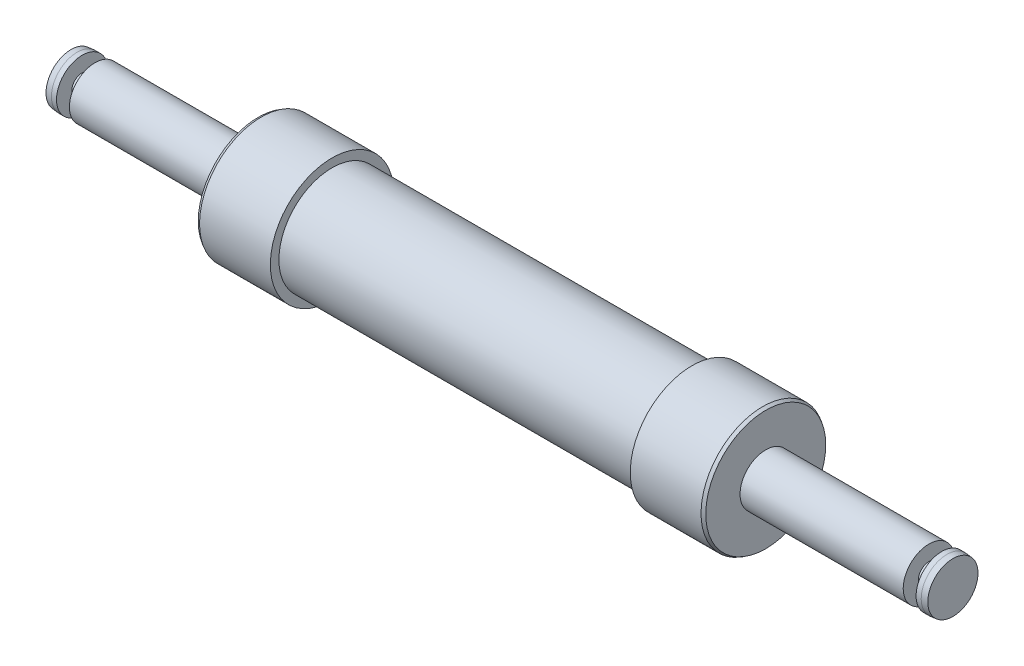
ISO-10303-21;
HEADER;
FILE_DESCRIPTION(('STEP AP214'),'2;1');
FILE_NAME('part.step','',(''),(''),'','','');
FILE_SCHEMA(('AUTOMOTIVE_DESIGN { 1 0 10303 214 1 1 1 1 }'));
ENDSEC;
DATA;
#1=APPLICATION_CONTEXT('core data for automotive mechanical design processes');
#2=APPLICATION_PROTOCOL_DEFINITION('international standard','automotive_design',2000,#1);
#3=PRODUCT_CONTEXT('',#1,'mechanical');
#4=PRODUCT('Part','Part','',(#3));
#5=PRODUCT_RELATED_PRODUCT_CATEGORY('part','',(#4));
#6=PRODUCT_DEFINITION_FORMATION('','',#4);
#7=PRODUCT_DEFINITION_CONTEXT('part definition',#1,'design');
#8=PRODUCT_DEFINITION('design','',#6,#7);
#9=PRODUCT_DEFINITION_SHAPE('','',#8);
#10=(LENGTH_UNIT() NAMED_UNIT(*) SI_UNIT(.MILLI.,.METRE.));
#11=(NAMED_UNIT(*) PLANE_ANGLE_UNIT() SI_UNIT($,.RADIAN.));
#12=(NAMED_UNIT(*) SI_UNIT($,.STERADIAN.) SOLID_ANGLE_UNIT());
#13=UNCERTAINTY_MEASURE_WITH_UNIT(LENGTH_MEASURE(1.E-05),#10,'distance_accuracy_value','');
#14=(GEOMETRIC_REPRESENTATION_CONTEXT(3) GLOBAL_UNCERTAINTY_ASSIGNED_CONTEXT((#13)) GLOBAL_UNIT_ASSIGNED_CONTEXT((#10,
#11,#12)) REPRESENTATION_CONTEXT('',''));
#15=CARTESIAN_POINT('',(0.,0.,0.));
#16=DIRECTION('',(0.,0.,1.));
#17=DIRECTION('',(1.,0.,0.));
#18=AXIS2_PLACEMENT_3D('',#15,#16,#17);
#19=CARTESIAN_POINT('',(0.,0.,0.));
#20=DIRECTION('',(-1.,0.,0.));
#21=DIRECTION('',(0.,-1.,0.));
#22=AXIS2_PLACEMENT_3D('',#19,#20,#21);
#23=CYLINDRICAL_SURFACE('',#22,7.2);
#24=CARTESIAN_POINT('',(-29.26,0.,0.));
#25=DIRECTION('',(1.,0.,0.));
#26=DIRECTION('',(0.,0.,-1.));
#27=AXIS2_PLACEMENT_3D('',#24,#25,#26);
#28=CIRCLE('',#27,7.2);
#29=CARTESIAN_POINT('',(-29.26,-7.2,0.));
#30=VERTEX_POINT('',#29);
#31=EDGE_CURVE('E56',#30,#30,#28,.T.);
#32=CARTESIAN_POINT('',(-21.,0.,0.));
#33=DIRECTION('',(1.,0.,0.));
#34=DIRECTION('',(0.,0.,-1.));
#35=AXIS2_PLACEMENT_3D('',#32,#33,#34);
#36=CIRCLE('',#35,7.2);
#37=CARTESIAN_POINT('',(-21.,-7.2,0.));
#38=VERTEX_POINT('',#37);
#39=EDGE_CURVE('E45',#38,#38,#36,.T.);
#40=CARTESIAN_POINT('',(-29.26,-7.2,0.));
#41=CARTESIAN_POINT('',(-29.1739583333333,-7.2,0.));
#42=CARTESIAN_POINT('',(-29.0879166666667,-7.2,0.));
#43=CARTESIAN_POINT('',(-28.9158333333333,-7.2,0.));
#44=CARTESIAN_POINT('',(-28.8297916666667,-7.2,0.));
#45=CARTESIAN_POINT('',(-28.6577083333333,-7.2,0.));
#46=CARTESIAN_POINT('',(-28.5716666666667,-7.2,0.));
#47=CARTESIAN_POINT('',(-28.3995833333333,-7.2,0.));
#48=CARTESIAN_POINT('',(-28.3135416666667,-7.2,0.));
#49=CARTESIAN_POINT('',(-28.1414583333333,-7.2,0.));
#50=CARTESIAN_POINT('',(-28.0554166666667,-7.2,0.));
#51=CARTESIAN_POINT('',(-27.8833333333333,-7.2,0.));
#52=CARTESIAN_POINT('',(-27.7972916666667,-7.2,0.));
#53=CARTESIAN_POINT('',(-27.6252083333333,-7.2,0.));
#54=CARTESIAN_POINT('',(-27.5391666666667,-7.2,0.));
#55=CARTESIAN_POINT('',(-27.3670833333333,-7.2,0.));
#56=CARTESIAN_POINT('',(-27.2810416666667,-7.2,0.));
#57=CARTESIAN_POINT('',(-27.1089583333333,-7.2,0.));
#58=CARTESIAN_POINT('',(-27.0229166666667,-7.2,0.));
#59=CARTESIAN_POINT('',(-26.8508333333333,-7.2,0.));
#60=CARTESIAN_POINT('',(-26.7647916666667,-7.2,0.));
#61=CARTESIAN_POINT('',(-26.5927083333333,-7.2,0.));
#62=CARTESIAN_POINT('',(-26.5066666666667,-7.2,0.));
#63=CARTESIAN_POINT('',(-26.3345833333333,-7.2,0.));
#64=CARTESIAN_POINT('',(-26.2485416666667,-7.2,0.));
#65=CARTESIAN_POINT('',(-26.0764583333333,-7.2,0.));
#66=CARTESIAN_POINT('',(-25.9904166666667,-7.2,0.));
#67=CARTESIAN_POINT('',(-25.8183333333333,-7.2,0.));
#68=CARTESIAN_POINT('',(-25.7322916666667,-7.2,0.));
#69=CARTESIAN_POINT('',(-25.5602083333333,-7.2,0.));
#70=CARTESIAN_POINT('',(-25.4741666666667,-7.2,0.));
#71=CARTESIAN_POINT('',(-25.3020833333333,-7.2,0.));
#72=CARTESIAN_POINT('',(-25.2160416666667,-7.2,0.));
#73=CARTESIAN_POINT('',(-25.0439583333333,-7.2,0.));
#74=CARTESIAN_POINT('',(-24.9579166666667,-7.2,0.));
#75=CARTESIAN_POINT('',(-24.7858333333333,-7.2,0.));
#76=CARTESIAN_POINT('',(-24.6997916666667,-7.2,0.));
#77=CARTESIAN_POINT('',(-24.5277083333333,-7.2,0.));
#78=CARTESIAN_POINT('',(-24.4416666666667,-7.2,0.));
#79=CARTESIAN_POINT('',(-24.2695833333333,-7.2,0.));
#80=CARTESIAN_POINT('',(-24.1835416666667,-7.2,0.));
#81=CARTESIAN_POINT('',(-24.0114583333333,-7.2,0.));
#82=CARTESIAN_POINT('',(-23.9254166666667,-7.2,0.));
#83=CARTESIAN_POINT('',(-23.7533333333333,-7.2,0.));
#84=CARTESIAN_POINT('',(-23.6672916666667,-7.2,0.));
#85=CARTESIAN_POINT('',(-23.4952083333333,-7.2,0.));
#86=CARTESIAN_POINT('',(-23.4091666666667,-7.2,0.));
#87=CARTESIAN_POINT('',(-23.2370833333333,-7.2,0.));
#88=CARTESIAN_POINT('',(-23.1510416666667,-7.2,0.));
#89=CARTESIAN_POINT('',(-22.9789583333333,-7.2,0.));
#90=CARTESIAN_POINT('',(-22.8929166666667,-7.2,0.));
#91=CARTESIAN_POINT('',(-22.7208333333333,-7.2,0.));
#92=CARTESIAN_POINT('',(-22.6347916666667,-7.2,0.));
#93=CARTESIAN_POINT('',(-22.4627083333333,-7.2,0.));
#94=CARTESIAN_POINT('',(-22.3766666666667,-7.2,0.));
#95=CARTESIAN_POINT('',(-22.2045833333333,-7.2,0.));
#96=CARTESIAN_POINT('',(-22.1185416666667,-7.2,0.));
#97=CARTESIAN_POINT('',(-21.9464583333334,-7.2,0.));
#98=CARTESIAN_POINT('',(-21.8604166666667,-7.2,0.));
#99=CARTESIAN_POINT('',(-21.6883333333334,-7.2,0.));
#100=CARTESIAN_POINT('',(-21.6022916666667,-7.2,0.));
#101=CARTESIAN_POINT('',(-21.4302083333334,-7.2,0.));
#102=CARTESIAN_POINT('',(-21.3441666666667,-7.2,0.));
#103=CARTESIAN_POINT('',(-21.1720833333334,-7.2,0.));
#104=CARTESIAN_POINT('',(-21.0860416666667,-7.2,0.));
#105=CARTESIAN_POINT('',(-21.,-7.2,0.));
#106=B_SPLINE_CURVE_WITH_KNOTS('',3,(#40,#41,#42,#43,#44,#45,#46,#47,#48,#49,#50,#51,#52,#53,
#54,#55,#56,#57,#58,#59,#60,#61,#62,#63,#64,#65,#66,#67,#68,#69,#70,#71,#72,#73,#74,#75,#76,#77,
#78,#79,#80,#81,#82,#83,#84,#85,#86,#87,#88,#89,#90,#91,#92,#93,#94,#95,#96,#97,#98,#99,#100,
#101,#102,#103,#104,#105),.UNSPECIFIED.,.F.,.F.,(4,2,2,2,2,2,2,2,2,2,2,2,2,2,2,2,2,2,2,2,2,2,2,
2,2,2,2,2,2,2,2,2,4),(0.,0.258124999999998,0.516249999999996,0.774374999999997,1.0325,
1.29062499999999,1.54874999999999,1.80687499999999,2.06499999999999,2.32312499999999,
2.58124999999999,2.83937499999999,3.09749999999999,3.35562499999998,3.61374999999998,
3.87187499999998,4.12999999999998,4.38812499999998,4.64624999999998,4.90437499999998,
5.16249999999998,5.42062499999997,5.67874999999998,5.93687499999997,6.19499999999997,
6.45312499999997,6.71124999999997,6.96937499999997,7.22749999999997,7.48562499999996,
7.74374999999997,8.00187499999996,8.25999999999996),.UNSPECIFIED.);
#107=EDGE_CURVE('BSEAM41',#30,#38,#106,.T.);
#108=ORIENTED_EDGE('',*,*,#31,.T.);
#109=ORIENTED_EDGE('',*,*,#39,.F.);
#110=ORIENTED_EDGE('',*,*,#107,.T.);
#111=ORIENTED_EDGE('',*,*,#107,.F.);
#112=EDGE_LOOP('',(#108,#110,#109,#111));
#113=FACE_BOUND('',#112,.T.);
#114=ADVANCED_FACE('F41',(#113),#23,.T.);
#115=CARTESIAN_POINT('',(-29.61,0.,0.));
#116=DIRECTION('',(-1.,0.,0.));
#117=DIRECTION('',(0.,0.,1.));
#118=AXIS2_PLACEMENT_3D('',#115,#116,#117);
#119=PLANE('',#118);
#120=CARTESIAN_POINT('',(-29.61,0.,0.));
#121=DIRECTION('',(-1.,0.,0.));
#122=DIRECTION('',(0.,0.,1.));
#123=AXIS2_PLACEMENT_3D('',#120,#121,#122);
#124=CIRCLE('',#123,7.);
#125=CARTESIAN_POINT('',(-29.61,0.,7.));
#126=VERTEX_POINT('',#125);
#127=EDGE_CURVE('E10',#126,#126,#124,.T.);
#128=ORIENTED_EDGE('',*,*,#127,.T.);
#129=EDGE_LOOP('',(#128));
#130=FACE_BOUND('',#129,.T.);
#131=CARTESIAN_POINT('',(-29.61,0.,0.));
#132=DIRECTION('',(-1.,0.,0.));
#133=DIRECTION('',(0.,0.,1.));
#134=AXIS2_PLACEMENT_3D('',#131,#132,#133);
#135=CIRCLE('',#134,3.);
#136=CARTESIAN_POINT('',(-29.61,0.,3.));
#137=VERTEX_POINT('',#136);
#138=EDGE_CURVE('E62',#137,#137,#135,.T.);
#139=ORIENTED_EDGE('',*,*,#138,.F.);
#140=EDGE_LOOP('',(#139));
#141=FACE_BOUND('',#140,.T.);
#142=ADVANCED_FACE('F160',(#130,#141),#119,.T.);
#143=CARTESIAN_POINT('',(-51.45,3.,0.));
#144=DIRECTION('',(1.,0.,0.));
#145=DIRECTION('',(0.,-1.,0.));
#146=AXIS2_PLACEMENT_3D('',#143,#144,#145);
#147=PLANE('',#146);
#148=CARTESIAN_POINT('',(-51.45,0.,0.));
#149=DIRECTION('',(-1.,0.,0.));
#150=DIRECTION('',(0.,0.,1.));
#151=AXIS2_PLACEMENT_3D('',#148,#149,#150);
#152=CIRCLE('',#151,2.92946920771663);
#153=CARTESIAN_POINT('',(-51.45,0.,2.92946920771663));
#154=VERTEX_POINT('',#153);
#155=EDGE_CURVE('E91',#154,#154,#152,.T.);
#156=ORIENTED_EDGE('',*,*,#155,.T.);
#157=EDGE_LOOP('',(#156));
#158=FACE_BOUND('',#157,.T.);
#159=ADVANCED_FACE('F167',(#158),#147,.F.);
#160=CARTESIAN_POINT('',(-50.7500000000002,0.,0.));
#161=DIRECTION('',(1.,0.,0.));
#162=DIRECTION('',(0.,0.,-1.));
#163=AXIS2_PLACEMENT_3D('',#160,#161,#162);
#164=CONICAL_SURFACE('',#163,3.,0.100419363009603);
#165=CARTESIAN_POINT('',(-50.7500000000002,0.,0.));
#166=DIRECTION('',(1.,0.,0.));
#167=DIRECTION('',(0.,0.,-1.));
#168=AXIS2_PLACEMENT_3D('',#165,#166,#167);
#169=CIRCLE('',#168,3.);
#170=CARTESIAN_POINT('',(-50.7500000000002,0.,-3.));
#171=VERTEX_POINT('',#170);
#172=EDGE_CURVE('E86',#171,#171,#169,.T.);
#173=ORIENTED_EDGE('',*,*,#172,.F.);
#174=EDGE_LOOP('',(#173));
#175=FACE_BOUND('',#174,.T.);
#176=ORIENTED_EDGE('',*,*,#155,.F.);
#177=EDGE_LOOP('',(#176));
#178=FACE_BOUND('',#177,.T.);
#179=ADVANCED_FACE('F359',(#175,#178),#164,.T.);
#180=CARTESIAN_POINT('',(0.,0.,0.));
#181=DIRECTION('',(1.,0.,0.));
#182=DIRECTION('',(0.,1.,0.));
#183=AXIS2_PLACEMENT_3D('',#180,#181,#182);
#184=CYLINDRICAL_SURFACE('',#183,3.);
#185=CARTESIAN_POINT('',(-50.155,0.,0.));
#186=DIRECTION('',(-1.,0.,0.));
#187=DIRECTION('',(0.,-1.,0.));
#188=AXIS2_PLACEMENT_3D('',#185,#186,#187);
#189=CIRCLE('',#188,3.);
#190=CARTESIAN_POINT('',(-50.155,-3.,0.));
#191=VERTEX_POINT('',#190);
#192=EDGE_CURVE('E72',#191,#191,#189,.T.);
#193=ORIENTED_EDGE('',*,*,#192,.T.);
#194=EDGE_LOOP('',(#193));
#195=FACE_BOUND('',#194,.T.);
#196=ORIENTED_EDGE('',*,*,#172,.T.);
#197=EDGE_LOOP('',(#196));
#198=FACE_BOUND('',#197,.T.);
#199=ADVANCED_FACE('F351',(#195,#198),#184,.T.);
#200=CARTESIAN_POINT('',(-50.155,1.22,0.));
#201=DIRECTION('',(-1.,0.,0.));
#202=DIRECTION('',(0.,0.,1.));
#203=AXIS2_PLACEMENT_3D('',#200,#201,#202);
#204=PLANE('',#203);
#205=CARTESIAN_POINT('',(-50.155,0.,0.));
#206=DIRECTION('',(1.,0.,0.));
#207=DIRECTION('',(0.,1.,0.));
#208=AXIS2_PLACEMENT_3D('',#205,#206,#207);
#209=CIRCLE('',#208,1.22);
#210=CARTESIAN_POINT('',(-50.155,1.22,0.));
#211=VERTEX_POINT('',#210);
#212=EDGE_CURVE('E73',#211,#211,#209,.T.);
#213=ORIENTED_EDGE('',*,*,#212,.F.);
#214=EDGE_LOOP('',(#213));
#215=FACE_BOUND('',#214,.T.);
#216=ORIENTED_EDGE('',*,*,#192,.F.);
#217=EDGE_LOOP('',(#216));
#218=FACE_BOUND('',#217,.T.);
#219=ADVANCED_FACE('F334',(#215,#218),#204,.F.);
#220=CARTESIAN_POINT('',(0.,0.,0.));
#221=DIRECTION('',(1.,0.,0.));
#222=DIRECTION('',(0.,0.,-1.));
#223=AXIS2_PLACEMENT_3D('',#220,#221,#222);
#224=CYLINDRICAL_SURFACE('',#223,1.22);
#225=CARTESIAN_POINT('',(-48.65,0.,0.));
#226=DIRECTION('',(1.,0.,0.));
#227=DIRECTION('',(0.,0.,-1.));
#228=AXIS2_PLACEMENT_3D('',#225,#226,#227);
#229=CIRCLE('',#228,1.22);
#230=CARTESIAN_POINT('',(-48.65,0.,-1.22));
#231=VERTEX_POINT('',#230);
#232=EDGE_CURVE('E74',#231,#231,#229,.T.);
#233=ORIENTED_EDGE('',*,*,#232,.F.);
#234=EDGE_LOOP('',(#233));
#235=FACE_BOUND('',#234,.T.);
#236=ORIENTED_EDGE('',*,*,#212,.T.);
#237=EDGE_LOOP('',(#236));
#238=FACE_BOUND('',#237,.T.);
#239=ADVANCED_FACE('F325',(#235,#238),#224,.T.);
#240=CARTESIAN_POINT('',(-48.65,1.22,0.));
#241=DIRECTION('',(1.,0.,0.));
#242=DIRECTION('',(0.,0.,-1.));
#243=AXIS2_PLACEMENT_3D('',#240,#241,#242);
#244=PLANE('',#243);
#245=ORIENTED_EDGE('',*,*,#232,.T.);
#246=EDGE_LOOP('',(#245));
#247=FACE_BOUND('',#246,.T.);
#248=CARTESIAN_POINT('',(-48.65,0.,0.));
#249=DIRECTION('',(1.,0.,0.));
#250=DIRECTION('',(0.,0.,-1.));
#251=AXIS2_PLACEMENT_3D('',#248,#249,#250);
#252=CIRCLE('',#251,3.);
#253=CARTESIAN_POINT('',(-48.65,0.,-3.));
#254=VERTEX_POINT('',#253);
#255=EDGE_CURVE('E68',#254,#254,#252,.T.);
#256=ORIENTED_EDGE('',*,*,#255,.F.);
#257=EDGE_LOOP('',(#256));
#258=FACE_BOUND('',#257,.T.);
#259=ADVANCED_FACE('F333',(#247,#258),#244,.F.);
#260=ORIENTED_EDGE('',*,*,#138,.T.);
#261=EDGE_LOOP('',(#260));
#262=FACE_BOUND('',#261,.T.);
#263=ORIENTED_EDGE('',*,*,#255,.T.);
#264=EDGE_LOOP('',(#263));
#265=FACE_BOUND('',#264,.T.);
#266=ADVANCED_FACE('F248',(#262,#265),#184,.T.);
#267=CARTESIAN_POINT('',(-29.26,0.,0.));
#268=DIRECTION('',(1.,0.,0.));
#269=DIRECTION('',(0.,0.,-1.));
#270=AXIS2_PLACEMENT_3D('',#267,#268,#269);
#271=CONICAL_SURFACE('',#270,7.2,0.519146114246495);
#272=ORIENTED_EDGE('',*,*,#31,.F.);
#273=EDGE_LOOP('',(#272));
#274=FACE_BOUND('',#273,.T.);
#275=ORIENTED_EDGE('',*,*,#127,.F.);
#276=EDGE_LOOP('',(#275));
#277=FACE_BOUND('',#276,.T.);
#278=ADVANCED_FACE('F43',(#274,#277),#271,.T.);
#279=CARTESIAN_POINT('',(-21.,6.2,0.));
#280=DIRECTION('',(1.,0.,0.));
#281=DIRECTION('',(0.,0.,-1.));
#282=AXIS2_PLACEMENT_3D('',#279,#280,#281);
#283=PLANE('',#282);
#284=CARTESIAN_POINT('',(-21.,0.,0.));
#285=DIRECTION('',(-1.,0.,0.));
#286=DIRECTION('',(0.,0.,1.));
#287=AXIS2_PLACEMENT_3D('',#284,#285,#286);
#288=CIRCLE('',#287,6.2);
#289=CARTESIAN_POINT('',(-21.,0.,6.2));
#290=VERTEX_POINT('',#289);
#291=EDGE_CURVE('E97',#290,#290,#288,.T.);
#292=ORIENTED_EDGE('',*,*,#291,.T.);
#293=EDGE_LOOP('',(#292));
#294=FACE_BOUND('',#293,.T.);
#295=ORIENTED_EDGE('',*,*,#39,.T.);
#296=EDGE_LOOP('',(#295));
#297=FACE_BOUND('',#296,.T.);
#298=ADVANCED_FACE('F247',(#294,#297),#283,.T.);
#299=CARTESIAN_POINT('',(21.,6.20000000000001,0.));
#300=DIRECTION('',(-1.,0.,0.));
#301=DIRECTION('',(0.,0.,1.));
#302=AXIS2_PLACEMENT_3D('',#299,#300,#301);
#303=PLANE('',#302);
#304=CARTESIAN_POINT('',(21.,0.,0.));
#305=DIRECTION('',(-1.,0.,0.));
#306=DIRECTION('',(0.,0.,1.));
#307=AXIS2_PLACEMENT_3D('',#304,#305,#306);
#308=CIRCLE('',#307,6.20000000000001);
#309=CARTESIAN_POINT('',(21.,0.,6.20000000000001));
#310=VERTEX_POINT('',#309);
#311=EDGE_CURVE('E104',#310,#310,#308,.T.);
#312=ORIENTED_EDGE('',*,*,#311,.F.);
#313=EDGE_LOOP('',(#312));
#314=FACE_BOUND('',#313,.T.);
#315=CARTESIAN_POINT('',(21.,0.,0.));
#316=DIRECTION('',(-1.,0.,0.));
#317=DIRECTION('',(0.,0.,1.));
#318=AXIS2_PLACEMENT_3D('',#315,#316,#317);
#319=CIRCLE('',#318,7.2);
#320=CARTESIAN_POINT('',(21.,-7.2,0.));
#321=VERTEX_POINT('',#320);
#322=EDGE_CURVE('E94',#321,#321,#319,.T.);
#323=ORIENTED_EDGE('',*,*,#322,.T.);
#324=EDGE_LOOP('',(#323));
#325=FACE_BOUND('',#324,.T.);
#326=ADVANCED_FACE('F265',(#314,#325),#303,.T.);
#327=CARTESIAN_POINT('',(-28.6049424910267,0.,0.));
#328=DIRECTION('',(-1.,0.,0.));
#329=DIRECTION('',(0.,0.,1.));
#330=AXIS2_PLACEMENT_3D('',#327,#328,#329);
#331=CYLINDRICAL_SURFACE('',#330,6.20000000000001);
#332=ORIENTED_EDGE('',*,*,#311,.T.);
#333=EDGE_LOOP('',(#332));
#334=FACE_BOUND('',#333,.T.);
#335=ORIENTED_EDGE('',*,*,#291,.F.);
#336=EDGE_LOOP('',(#335));
#337=FACE_BOUND('',#336,.T.);
#338=ADVANCED_FACE('F157',(#334,#337),#331,.T.);
#339=CARTESIAN_POINT('',(51.45,3.,0.));
#340=DIRECTION('',(-1.,0.,0.));
#341=DIRECTION('',(0.,-1.,0.));
#342=AXIS2_PLACEMENT_3D('',#339,#340,#341);
#343=PLANE('',#342);
#344=CARTESIAN_POINT('',(51.45,0.,0.));
#345=DIRECTION('',(1.,0.,0.));
#346=DIRECTION('',(0.,0.,-1.));
#347=AXIS2_PLACEMENT_3D('',#344,#345,#346);
#348=CIRCLE('',#347,2.92946920771663);
#349=CARTESIAN_POINT('',(51.45,0.,-2.92946920771663));
#350=VERTEX_POINT('',#349);
#351=EDGE_CURVE('E60',#350,#350,#348,.T.);
#352=ORIENTED_EDGE('',*,*,#351,.T.);
#353=EDGE_LOOP('',(#352));
#354=FACE_BOUND('',#353,.T.);
#355=ADVANCED_FACE('F142',(#354),#343,.F.);
#356=CARTESIAN_POINT('',(50.7500000000002,0.,0.));
#357=DIRECTION('',(-1.,0.,0.));
#358=DIRECTION('',(0.,0.,1.));
#359=AXIS2_PLACEMENT_3D('',#356,#357,#358);
#360=CONICAL_SURFACE('',#359,3.,0.100419363009603);
#361=ORIENTED_EDGE('',*,*,#351,.F.);
#362=EDGE_LOOP('',(#361));
#363=FACE_BOUND('',#362,.T.);
#364=CARTESIAN_POINT('',(50.7500000000002,0.,0.));
#365=DIRECTION('',(-1.,0.,0.));
#366=DIRECTION('',(0.,0.,1.));
#367=AXIS2_PLACEMENT_3D('',#364,#365,#366);
#368=CIRCLE('',#367,3.);
#369=CARTESIAN_POINT('',(50.7500000000002,0.,3.));
#370=VERTEX_POINT('',#369);
#371=EDGE_CURVE('E85',#370,#370,#368,.T.);
#372=ORIENTED_EDGE('',*,*,#371,.F.);
#373=EDGE_LOOP('',(#372));
#374=FACE_BOUND('',#373,.T.);
#375=ADVANCED_FACE('F144',(#363,#374),#360,.T.);
#376=CARTESIAN_POINT('',(0.,0.,0.));
#377=DIRECTION('',(-1.,0.,0.));
#378=DIRECTION('',(0.,-1.,0.));
#379=AXIS2_PLACEMENT_3D('',#376,#377,#378);
#380=CYLINDRICAL_SURFACE('',#379,3.);
#381=CARTESIAN_POINT('',(50.155,0.,0.));
#382=DIRECTION('',(1.,0.,0.));
#383=DIRECTION('',(0.,1.,0.));
#384=AXIS2_PLACEMENT_3D('',#381,#382,#383);
#385=CIRCLE('',#384,3.);
#386=CARTESIAN_POINT('',(50.155,3.,0.));
#387=VERTEX_POINT('',#386);
#388=EDGE_CURVE('E78',#387,#387,#385,.T.);
#389=ORIENTED_EDGE('',*,*,#388,.T.);
#390=EDGE_LOOP('',(#389));
#391=FACE_BOUND('',#390,.T.);
#392=ORIENTED_EDGE('',*,*,#371,.T.);
#393=EDGE_LOOP('',(#392));
#394=FACE_BOUND('',#393,.T.);
#395=ADVANCED_FACE('F147',(#391,#394),#380,.T.);
#396=CARTESIAN_POINT('',(50.155,1.22,0.));
#397=DIRECTION('',(1.,0.,0.));
#398=DIRECTION('',(0.,0.,1.));
#399=AXIS2_PLACEMENT_3D('',#396,#397,#398);
#400=PLANE('',#399);
#401=CARTESIAN_POINT('',(50.155,0.,0.));
#402=DIRECTION('',(1.,0.,0.));
#403=DIRECTION('',(0.,1.,0.));
#404=AXIS2_PLACEMENT_3D('',#401,#402,#403);
#405=CIRCLE('',#404,1.22);
#406=CARTESIAN_POINT('',(50.155,1.22,0.));
#407=VERTEX_POINT('',#406);
#408=EDGE_CURVE('E125',#407,#407,#405,.T.);
#409=ORIENTED_EDGE('',*,*,#408,.T.);
#410=EDGE_LOOP('',(#409));
#411=FACE_BOUND('',#410,.T.);
#412=ORIENTED_EDGE('',*,*,#388,.F.);
#413=EDGE_LOOP('',(#412));
#414=FACE_BOUND('',#413,.T.);
#415=ADVANCED_FACE('F153',(#411,#414),#400,.F.);
#416=CARTESIAN_POINT('',(0.,0.,0.));
#417=DIRECTION('',(-1.,0.,0.));
#418=DIRECTION('',(0.,0.,1.));
#419=AXIS2_PLACEMENT_3D('',#416,#417,#418);
#420=CYLINDRICAL_SURFACE('',#419,1.22);
#421=CARTESIAN_POINT('',(48.65,0.,0.));
#422=DIRECTION('',(1.,0.,0.));
#423=DIRECTION('',(0.,0.,-1.));
#424=AXIS2_PLACEMENT_3D('',#421,#422,#423);
#425=CIRCLE('',#424,1.22);
#426=CARTESIAN_POINT('',(48.65,0.,-1.22));
#427=VERTEX_POINT('',#426);
#428=EDGE_CURVE('E66',#427,#427,#425,.T.);
#429=ORIENTED_EDGE('',*,*,#428,.T.);
#430=EDGE_LOOP('',(#429));
#431=FACE_BOUND('',#430,.T.);
#432=ORIENTED_EDGE('',*,*,#408,.F.);
#433=EDGE_LOOP('',(#432));
#434=FACE_BOUND('',#433,.T.);
#435=ADVANCED_FACE('F195',(#431,#434),#420,.T.);
#436=CARTESIAN_POINT('',(48.65,1.22,0.));
#437=DIRECTION('',(-1.,0.,0.));
#438=DIRECTION('',(0.,0.,-1.));
#439=AXIS2_PLACEMENT_3D('',#436,#437,#438);
#440=PLANE('',#439);
#441=ORIENTED_EDGE('',*,*,#428,.F.);
#442=EDGE_LOOP('',(#441));
#443=FACE_BOUND('',#442,.T.);
#444=CARTESIAN_POINT('',(48.65,0.,0.));
#445=DIRECTION('',(-1.,0.,0.));
#446=DIRECTION('',(0.,0.,1.));
#447=AXIS2_PLACEMENT_3D('',#444,#445,#446);
#448=CIRCLE('',#447,3.);
#449=CARTESIAN_POINT('',(48.65,0.,3.));
#450=VERTEX_POINT('',#449);
#451=EDGE_CURVE('E121',#450,#450,#448,.T.);
#452=ORIENTED_EDGE('',*,*,#451,.F.);
#453=EDGE_LOOP('',(#452));
#454=FACE_BOUND('',#453,.T.);
#455=ADVANCED_FACE('F191',(#443,#454),#440,.F.);
#456=CARTESIAN_POINT('',(29.61,0.,0.));
#457=DIRECTION('',(1.,0.,0.));
#458=DIRECTION('',(0.,0.,-1.));
#459=AXIS2_PLACEMENT_3D('',#456,#457,#458);
#460=CIRCLE('',#459,3.);
#461=CARTESIAN_POINT('',(29.61,0.,-3.));
#462=VERTEX_POINT('',#461);
#463=EDGE_CURVE('E67',#462,#462,#460,.T.);
#464=ORIENTED_EDGE('',*,*,#463,.T.);
#465=EDGE_LOOP('',(#464));
#466=FACE_BOUND('',#465,.T.);
#467=ORIENTED_EDGE('',*,*,#451,.T.);
#468=EDGE_LOOP('',(#467));
#469=FACE_BOUND('',#468,.T.);
#470=ADVANCED_FACE('F156',(#466,#469),#380,.T.);
#471=CARTESIAN_POINT('',(29.61,0.,0.));
#472=DIRECTION('',(1.,0.,0.));
#473=DIRECTION('',(0.,0.,-1.));
#474=AXIS2_PLACEMENT_3D('',#471,#472,#473);
#475=PLANE('',#474);
#476=CARTESIAN_POINT('',(29.61,0.,0.));
#477=DIRECTION('',(1.,0.,0.));
#478=DIRECTION('',(0.,0.,-1.));
#479=AXIS2_PLACEMENT_3D('',#476,#477,#478);
#480=CIRCLE('',#479,7.);
#481=CARTESIAN_POINT('',(29.61,0.,-7.));
#482=VERTEX_POINT('',#481);
#483=EDGE_CURVE('E90',#482,#482,#480,.T.);
#484=ORIENTED_EDGE('',*,*,#483,.T.);
#485=EDGE_LOOP('',(#484));
#486=FACE_BOUND('',#485,.T.);
#487=ORIENTED_EDGE('',*,*,#463,.F.);
#488=EDGE_LOOP('',(#487));
#489=FACE_BOUND('',#488,.T.);
#490=ADVANCED_FACE('F177',(#486,#489),#475,.T.);
#491=CARTESIAN_POINT('',(29.26,0.,0.));
#492=DIRECTION('',(-1.,0.,0.));
#493=DIRECTION('',(0.,0.,1.));
#494=AXIS2_PLACEMENT_3D('',#491,#492,#493);
#495=CONICAL_SURFACE('',#494,7.2,0.519146114246495);
#496=CARTESIAN_POINT('',(29.26,0.,0.));
#497=DIRECTION('',(-1.,0.,0.));
#498=DIRECTION('',(0.,0.,1.));
#499=AXIS2_PLACEMENT_3D('',#496,#497,#498);
#500=CIRCLE('',#499,7.2);
#501=CARTESIAN_POINT('',(29.26,-7.2,0.));
#502=VERTEX_POINT('',#501);
#503=EDGE_CURVE('E50',#502,#502,#500,.T.);
#504=ORIENTED_EDGE('',*,*,#503,.F.);
#505=EDGE_LOOP('',(#504));
#506=FACE_BOUND('',#505,.T.);
#507=ORIENTED_EDGE('',*,*,#483,.F.);
#508=EDGE_LOOP('',(#507));
#509=FACE_BOUND('',#508,.T.);
#510=ADVANCED_FACE('F172',(#506,#509),#495,.T.);
#511=CARTESIAN_POINT('',(29.26,-7.2,0.));
#512=CARTESIAN_POINT('',(29.1739583333333,-7.2,0.));
#513=CARTESIAN_POINT('',(29.0879166666667,-7.2,0.));
#514=CARTESIAN_POINT('',(28.9158333333333,-7.2,0.));
#515=CARTESIAN_POINT('',(28.8297916666667,-7.2,0.));
#516=CARTESIAN_POINT('',(28.6577083333333,-7.2,0.));
#517=CARTESIAN_POINT('',(28.5716666666667,-7.2,0.));
#518=CARTESIAN_POINT('',(28.3995833333333,-7.2,0.));
#519=CARTESIAN_POINT('',(28.3135416666667,-7.2,0.));
#520=CARTESIAN_POINT('',(28.1414583333333,-7.2,0.));
#521=CARTESIAN_POINT('',(28.0554166666667,-7.2,0.));
#522=CARTESIAN_POINT('',(27.8833333333333,-7.2,0.));
#523=CARTESIAN_POINT('',(27.7972916666667,-7.2,0.));
#524=CARTESIAN_POINT('',(27.6252083333333,-7.2,0.));
#525=CARTESIAN_POINT('',(27.5391666666667,-7.2,0.));
#526=CARTESIAN_POINT('',(27.3670833333333,-7.2,0.));
#527=CARTESIAN_POINT('',(27.2810416666667,-7.2,0.));
#528=CARTESIAN_POINT('',(27.1089583333333,-7.2,0.));
#529=CARTESIAN_POINT('',(27.0229166666667,-7.2,0.));
#530=CARTESIAN_POINT('',(26.8508333333333,-7.2,0.));
#531=CARTESIAN_POINT('',(26.7647916666667,-7.2,0.));
#532=CARTESIAN_POINT('',(26.5927083333333,-7.2,0.));
#533=CARTESIAN_POINT('',(26.5066666666666,-7.2,0.));
#534=CARTESIAN_POINT('',(26.3345833333333,-7.2,0.));
#535=CARTESIAN_POINT('',(26.2485416666667,-7.2,0.));
#536=CARTESIAN_POINT('',(26.0764583333333,-7.2,0.));
#537=CARTESIAN_POINT('',(25.9904166666667,-7.2,0.));
#538=CARTESIAN_POINT('',(25.8183333333333,-7.2,0.));
#539=CARTESIAN_POINT('',(25.7322916666667,-7.2,0.));
#540=CARTESIAN_POINT('',(25.5602083333333,-7.2,0.));
#541=CARTESIAN_POINT('',(25.4741666666667,-7.2,0.));
#542=CARTESIAN_POINT('',(25.3020833333333,-7.2,0.));
#543=CARTESIAN_POINT('',(25.2160416666667,-7.2,0.));
#544=CARTESIAN_POINT('',(25.0439583333333,-7.2,0.));
#545=CARTESIAN_POINT('',(24.9579166666667,-7.2,0.));
#546=CARTESIAN_POINT('',(24.7858333333333,-7.2,0.));
#547=CARTESIAN_POINT('',(24.6997916666667,-7.2,0.));
#548=CARTESIAN_POINT('',(24.5277083333333,-7.2,0.));
#549=CARTESIAN_POINT('',(24.4416666666667,-7.2,0.));
#550=CARTESIAN_POINT('',(24.2695833333333,-7.2,0.));
#551=CARTESIAN_POINT('',(24.1835416666667,-7.2,0.));
#552=CARTESIAN_POINT('',(24.0114583333333,-7.2,0.));
#553=CARTESIAN_POINT('',(23.9254166666667,-7.2,0.));
#554=CARTESIAN_POINT('',(23.7533333333333,-7.2,0.));
#555=CARTESIAN_POINT('',(23.6672916666667,-7.2,0.));
#556=CARTESIAN_POINT('',(23.4952083333333,-7.2,0.));
#557=CARTESIAN_POINT('',(23.4091666666667,-7.2,0.));
#558=CARTESIAN_POINT('',(23.2370833333333,-7.2,0.));
#559=CARTESIAN_POINT('',(23.1510416666667,-7.2,0.));
#560=CARTESIAN_POINT('',(22.9789583333333,-7.2,0.));
#561=CARTESIAN_POINT('',(22.8929166666667,-7.2,0.));
#562=CARTESIAN_POINT('',(22.7208333333333,-7.2,0.));
#563=CARTESIAN_POINT('',(22.6347916666667,-7.2,0.));
#564=CARTESIAN_POINT('',(22.4627083333333,-7.2,0.));
#565=CARTESIAN_POINT('',(22.3766666666667,-7.2,0.));
#566=CARTESIAN_POINT('',(22.2045833333333,-7.2,0.));
#567=CARTESIAN_POINT('',(22.1185416666667,-7.2,0.));
#568=CARTESIAN_POINT('',(21.9464583333333,-7.2,0.));
#569=CARTESIAN_POINT('',(21.8604166666667,-7.2,0.));
#570=CARTESIAN_POINT('',(21.6883333333333,-7.2,0.));
#571=CARTESIAN_POINT('',(21.6022916666667,-7.2,0.));
#572=CARTESIAN_POINT('',(21.4302083333333,-7.2,0.));
#573=CARTESIAN_POINT('',(21.3441666666667,-7.2,0.));
#574=CARTESIAN_POINT('',(21.1720833333333,-7.2,0.));
#575=CARTESIAN_POINT('',(21.0860416666667,-7.2,0.));
#576=CARTESIAN_POINT('',(21.,-7.2,0.));
#577=B_SPLINE_CURVE_WITH_KNOTS('',3,(#511,#512,#513,#514,#515,#516,#517,#518,#519,#520,#521,
#522,#523,#524,#525,#526,#527,#528,#529,#530,#531,#532,#533,#534,#535,#536,#537,#538,#539,#540,
#541,#542,#543,#544,#545,#546,#547,#548,#549,#550,#551,#552,#553,#554,#555,#556,#557,#558,#559,
#560,#561,#562,#563,#564,#565,#566,#567,#568,#569,#570,#571,#572,#573,#574,#575,#576),
.UNSPECIFIED.,.F.,.F.,(4,2,2,2,2,2,2,2,2,2,2,2,2,2,2,2,2,2,2,2,2,2,2,2,2,2,2,2,2,2,2,2,4),(0.,
0.258125000000001,0.516249999999999,0.774375000000001,1.0325,1.290625,1.54875,1.806875,2.065,
2.323125,2.58125,2.839375,3.0975,3.355625,3.61375,3.871875,4.13,4.388125,4.64625,4.904375,
5.1625,5.420625,5.67875,5.936875,6.195,6.453125,6.71125,6.969375,7.2275,7.485625,7.74375,
8.001875,8.26),.UNSPECIFIED.);
#578=EDGE_CURVE('BSEAM163',#502,#321,#577,.T.);
#579=ORIENTED_EDGE('',*,*,#503,.T.);
#580=ORIENTED_EDGE('',*,*,#322,.F.);
#581=ORIENTED_EDGE('',*,*,#578,.T.);
#582=ORIENTED_EDGE('',*,*,#578,.F.);
#583=EDGE_LOOP('',(#579,#581,#580,#582));
#584=FACE_BOUND('',#583,.T.);
#585=ADVANCED_FACE('F163',(#584),#23,.T.);
#586=CLOSED_SHELL('',(#114,#142,#159,#179,#199,#219,#239,#259,#266,#278,#298,#326,#338,#355,
#375,#395,#415,#435,#455,#470,#490,#510,#585));
#587=MANIFOLD_SOLID_BREP('B2',#586);
#588=ADVANCED_BREP_SHAPE_REPRESENTATION('',(#18,#587),#14);
#589=SHAPE_DEFINITION_REPRESENTATION(#9,#588);
ENDSEC;
END-ISO-10303-21;
